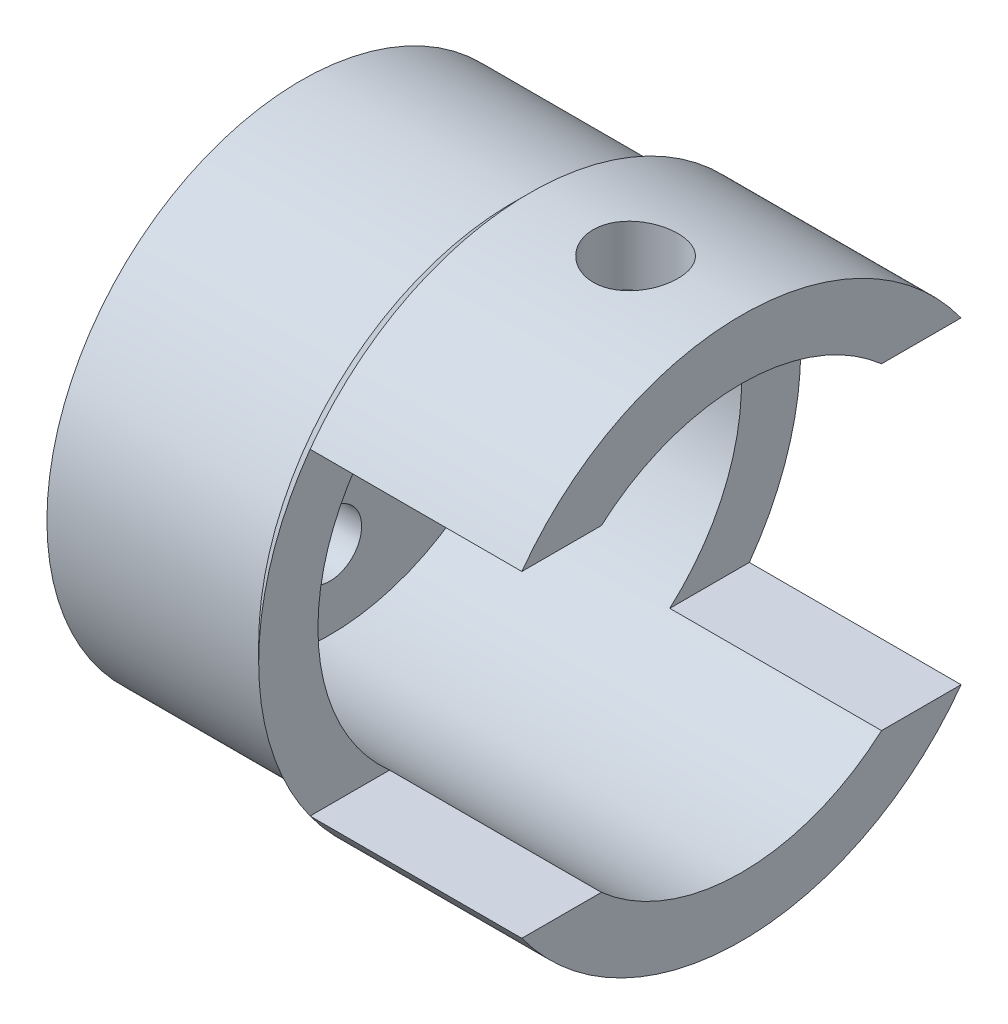
ISO-10303-21;
HEADER;
FILE_DESCRIPTION(('STEP AP214'),'2;1');
FILE_NAME('part.step','',(''),(''),'','','');
FILE_SCHEMA(('AUTOMOTIVE_DESIGN { 1 0 10303 214 1 1 1 1 }'));
ENDSEC;
DATA;
#1=APPLICATION_CONTEXT('core data for automotive mechanical design processes');
#2=APPLICATION_PROTOCOL_DEFINITION('international standard','automotive_design',2000,#1);
#3=PRODUCT_CONTEXT('',#1,'mechanical');
#4=PRODUCT('Part','Part','',(#3));
#5=PRODUCT_RELATED_PRODUCT_CATEGORY('part','',(#4));
#6=PRODUCT_DEFINITION_FORMATION('','',#4);
#7=PRODUCT_DEFINITION_CONTEXT('part definition',#1,'design');
#8=PRODUCT_DEFINITION('design','',#6,#7);
#9=PRODUCT_DEFINITION_SHAPE('','',#8);
#10=(LENGTH_UNIT() NAMED_UNIT(*) SI_UNIT(.MILLI.,.METRE.));
#11=(NAMED_UNIT(*) PLANE_ANGLE_UNIT() SI_UNIT($,.RADIAN.));
#12=(NAMED_UNIT(*) SI_UNIT($,.STERADIAN.) SOLID_ANGLE_UNIT());
#13=UNCERTAINTY_MEASURE_WITH_UNIT(LENGTH_MEASURE(1.E-05),#10,'distance_accuracy_value','');
#14=(GEOMETRIC_REPRESENTATION_CONTEXT(3) GLOBAL_UNCERTAINTY_ASSIGNED_CONTEXT((#13)) GLOBAL_UNIT_ASSIGNED_CONTEXT((#10,
#11,#12)) REPRESENTATION_CONTEXT('',''));
#15=CARTESIAN_POINT('',(0.,0.,0.));
#16=DIRECTION('',(0.,0.,1.));
#17=DIRECTION('',(1.,0.,0.));
#18=AXIS2_PLACEMENT_3D('',#15,#16,#17);
#19=CARTESIAN_POINT('',(20.7985083905838,12.7985083905838,0.));
#20=DIRECTION('',(-1.,0.,0.));
#21=DIRECTION('',(0.,0.,1.));
#22=AXIS2_PLACEMENT_3D('',#19,#20,#21);
#23=PLANE('',#22);
#24=CARTESIAN_POINT('',(20.7985083905838,0.,0.));
#25=DIRECTION('',(-1.,0.,0.));
#26=DIRECTION('',(0.,0.,1.));
#27=AXIS2_PLACEMENT_3D('',#24,#25,#26);
#28=CIRCLE('',#27,12.7985083905838);
#29=CARTESIAN_POINT('',(20.7985083905838,7.50149160941622,10.369640334057));
#30=VERTEX_POINT('',#29);
#31=CARTESIAN_POINT('',(20.7985083905838,7.50149160941622,-10.369640334057));
#32=VERTEX_POINT('',#31);
#33=EDGE_CURVE('E144',#30,#32,#28,.T.);
#34=ORIENTED_EDGE('',*,*,#33,.F.);
#35=DIRECTION('',(0.,0.,-1.));
#36=VECTOR('',#35,1.);
#37=CARTESIAN_POINT('',(20.7985083905838,7.50149160941622,12.7985083905838));
#38=LINE('',#37,#36);
#39=CARTESIAN_POINT('',(20.7985083905838,7.50149160941622,6.61268656703598));
#40=VERTEX_POINT('',#39);
#41=EDGE_CURVE('E160',#30,#40,#38,.T.);
#42=ORIENTED_EDGE('',*,*,#41,.T.);
#43=CARTESIAN_POINT('',(20.7985083905838,0.,0.));
#44=DIRECTION('',(-1.,0.,0.));
#45=DIRECTION('',(0.,0.,1.));
#46=AXIS2_PLACEMENT_3D('',#43,#44,#45);
#47=CIRCLE('',#46,10.);
#48=CARTESIAN_POINT('',(20.7985083905838,7.50149160941622,-6.61268656703598));
#49=VERTEX_POINT('',#48);
#50=EDGE_CURVE('E45',#40,#49,#47,.T.);
#51=ORIENTED_EDGE('',*,*,#50,.T.);
#52=EDGE_CURVE('E161',#49,#32,#38,.T.);
#53=ORIENTED_EDGE('',*,*,#52,.T.);
#54=EDGE_LOOP('',(#34,#42,#51,#53));
#55=FACE_BOUND('',#54,.T.);
#56=ADVANCED_FACE('F32',(#55),#23,.F.);
#57=CARTESIAN_POINT('',(0.,0.,0.));
#58=DIRECTION('',(-1.,0.,0.));
#59=DIRECTION('',(0.,0.,1.));
#60=AXIS2_PLACEMENT_3D('',#57,#58,#59);
#61=CYLINDRICAL_SURFACE('',#60,12.7985083905838);
#62=CARTESIAN_POINT('',(15.7985083905838,12.6412743433502,2.));
#63=CARTESIAN_POINT('',(15.6869058605762,12.641276267797,1.99999543357107));
#64=CARTESIAN_POINT('',(15.5752399420003,12.6427682559038,1.99062705088806));
#65=CARTESIAN_POINT('',(15.3550341977451,12.6485704548972,1.95341329939025));
#66=CARTESIAN_POINT('',(15.2464974642779,12.65288336,1.92555026623031));
#67=CARTESIAN_POINT('',(15.035769181485,12.6638272481015,1.8522046351433));
#68=CARTESIAN_POINT('',(14.9335726792747,12.6704563941417,1.80673599674197));
#69=CARTESIAN_POINT('',(14.7382726580606,12.6852836500622,1.69950342909167));
#70=CARTESIAN_POINT('',(14.6451679728494,12.6934815583171,1.63774159354278));
#71=CARTESIAN_POINT('',(14.4698732090248,12.7106021747007,1.49910361434302));
#72=CARTESIAN_POINT('',(14.387773486387,12.7195300161363,1.42211384315624));
#73=CARTESIAN_POINT('',(14.2376028270097,12.7370588199866,1.25545089563176));
#74=CARTESIAN_POINT('',(14.1695326831224,12.745659763905,1.16577700296029));
#75=CARTESIAN_POINT('',(14.0490179083089,12.761619621821,0.975709988234255));
#76=CARTESIAN_POINT('',(13.996656815719,12.7689718084111,0.875263284400821));
#77=CARTESIAN_POINT('',(13.9095828872721,12.7815488035089,0.666866593211987));
#78=CARTESIAN_POINT('',(13.8748690409104,12.7867737338227,0.558917035882352));
#79=CARTESIAN_POINT('',(13.8243498288832,12.7944712847631,0.339510639666842));
#80=CARTESIAN_POINT('',(13.8083929570219,12.7969659471815,0.228089471550327));
#81=CARTESIAN_POINT('',(13.7953699648494,12.7989974939656,0.0041251175521217));
#82=CARTESIAN_POINT('',(13.7983027091467,12.7985345561028,-0.108418000486929));
#83=CARTESIAN_POINT('',(13.8228566498631,12.7947206148355,-0.33039709372246));
#84=CARTESIAN_POINT('',(13.8443148302482,12.791394804249,-0.439851595198562));
#85=CARTESIAN_POINT('',(13.905054346536,12.7822568744753,-0.653586977627946));
#86=CARTESIAN_POINT('',(13.944336172537,12.7764446869204,-0.757867716230341));
#87=CARTESIAN_POINT('',(14.0397730167662,12.7629439003276,-0.958785697552394));
#88=CARTESIAN_POINT('',(14.0959961305402,12.7552477525786,-1.05539006672247));
#89=CARTESIAN_POINT('',(14.2236698046218,12.7388358094737,-1.23785467216926));
#90=CARTESIAN_POINT('',(14.295121451328,12.7301199413913,-1.32371414121434));
#91=CARTESIAN_POINT('',(14.4521306320659,12.7125298134921,-1.48321345968578));
#92=CARTESIAN_POINT('',(14.5378305506789,12.7036548559482,-1.55671314020442));
#93=CARTESIAN_POINT('',(14.7204212808508,12.686837254181,-1.68831051307547));
#94=CARTESIAN_POINT('',(14.817312172947,12.6788946166681,-1.74640809457469));
#95=CARTESIAN_POINT('',(15.0196865587552,12.6648409336946,-1.84557415390882));
#96=CARTESIAN_POINT('',(15.1251776737784,12.6587315357446,-1.88662732676936));
#97=CARTESIAN_POINT('',(15.3416746959378,12.6490644906922,-1.950393445058));
#98=CARTESIAN_POINT('',(15.4526801787227,12.6455066475624,-1.97310779941372));
#99=CARTESIAN_POINT('',(15.6758052342861,12.6413830051067,-1.99935739907929));
#100=CARTESIAN_POINT('',(15.7879008288749,12.6407861461156,-2.00309174808386));
#101=CARTESIAN_POINT('',(16.0111164244017,12.6425694918701,-1.99180447200951));
#102=CARTESIAN_POINT('',(16.1222364581654,12.6449495960575,-1.97678348046343));
#103=CARTESIAN_POINT('',(16.339724128783,12.6523900987213,-1.92858110818959));
#104=CARTESIAN_POINT('',(16.4461144731461,12.6574357366734,-1.89549970449695));
#105=CARTESIAN_POINT('',(16.6518405164068,12.6696265409608,-1.81221987696943));
#106=CARTESIAN_POINT('',(16.7511758394319,12.6767718190553,-1.76202054196291));
#107=CARTESIAN_POINT('',(16.9408622714874,12.6924296202181,-1.64545454173463));
#108=CARTESIAN_POINT('',(17.0311335712755,12.7009528105223,-1.57895946190561));
#109=CARTESIAN_POINT('',(17.1993073570685,12.7183743017194,-1.43186721215676));
#110=CARTESIAN_POINT('',(17.2772090813452,12.7272726256707,-1.35126917440749));
#111=CARTESIAN_POINT('',(17.4191517880307,12.7445392695237,-1.17738011445609));
#112=CARTESIAN_POINT('',(17.483060516133,12.7529020444379,-1.08398050257701));
#113=CARTESIAN_POINT('',(17.5942798717231,12.7680681664951,-0.887655263176701));
#114=CARTESIAN_POINT('',(17.6415909843325,12.7748715592143,-0.784729914188609));
#115=CARTESIAN_POINT('',(17.7180628032108,12.7861281353381,-0.572680474982769));
#116=CARTESIAN_POINT('',(17.7472946870717,12.7905905245543,-0.463582563135936));
#117=CARTESIAN_POINT('',(17.7870082110859,12.7967010488831,-0.241951300861597));
#118=CARTESIAN_POINT('',(17.7974912000507,12.7983493864406,-0.129418198157121));
#119=CARTESIAN_POINT('',(17.7993742913255,12.798643752792,0.0946086136872319));
#120=CARTESIAN_POINT('',(17.7909763360435,12.7973215532737,0.206100635873306));
#121=CARTESIAN_POINT('',(17.7557702138955,12.7918877612436,0.426066077647656));
#122=CARTESIAN_POINT('',(17.7289621211659,12.7877761799645,0.534539509389764));
#123=CARTESIAN_POINT('',(17.6577705162137,12.7772236117483,0.745325224144663));
#124=CARTESIAN_POINT('',(17.6134021559729,12.770784633434,0.847642731381726));
#125=CARTESIAN_POINT('',(17.5083713307282,12.7562829211048,1.04341257371094));
#126=CARTESIAN_POINT('',(17.4477082467586,12.7482201254111,1.13686457185836));
#127=CARTESIAN_POINT('',(17.3110849233018,12.7312637354005,1.31327243090961));
#128=CARTESIAN_POINT('',(17.234976007918,12.722362555283,1.39611242834961));
#129=CARTESIAN_POINT('',(17.0699341932363,12.7047874005652,1.54791767104431));
#130=CARTESIAN_POINT('',(16.9809982919691,12.6961134797148,1.61687965927815));
#131=CARTESIAN_POINT('',(16.7921825857016,12.6799176923513,1.73935488854612));
#132=CARTESIAN_POINT('',(16.6922389589204,12.6724032237801,1.79277070906887));
#133=CARTESIAN_POINT('',(16.4847255103249,12.659464111906,1.8819762677244));
#134=CARTESIAN_POINT('',(16.3771636253004,12.6540373304704,1.91778404988061));
#135=CARTESIAN_POINT('',(16.1907025704876,12.6471236100172,1.9627573441535));
#136=CARTESIAN_POINT('',(16.1129471438257,12.6449419691942,1.97670159728243));
#137=CARTESIAN_POINT('',(15.9563078288117,12.6420166660549,1.9953244714291));
#138=CARTESIAN_POINT('',(15.8774239571052,12.6412729825494,2.00000322897991));
#139=CARTESIAN_POINT('',(15.7985083905838,12.6412743433502,2.));
#140=B_SPLINE_CURVE_WITH_KNOTS('',3,(#62,#63,#64,#65,#66,#67,#68,#69,#70,#71,#72,#73,#74,#75,
#76,#77,#78,#79,#80,#81,#82,#83,#84,#85,#86,#87,#88,#89,#90,#91,#92,#93,#94,#95,#96,#97,#98,#99,
#100,#101,#102,#103,#104,#105,#106,#107,#108,#109,#110,#111,#112,#113,#114,#115,#116,#117,#118,
#119,#120,#121,#122,#123,#124,#125,#126,#127,#128,#129,#130,#131,#132,#133,#134,#135,#136,#137,
#138,#139),.UNSPECIFIED.,.T.,.F.,(4,2,2,2,2,2,2,2,2,2,2,2,2,2,2,2,2,2,2,2,2,2,2,2,2,2,2,2,2,2,2,
2,2,2,2,2,2,2,4),(0.,0.33451909675687,0.669358155211654,1.00393226087374,1.33846339418985,
1.6755918988916,2.0127394504802,2.35164935486035,2.69053985062487,3.02667378615881,
3.362787517995,3.69597339205187,4.02916842830526,4.36372102472492,4.6982974960112,
5.03644414968647,5.3745932370312,5.71304531100723,6.05147138004382,6.38633986203007,
6.72119703286797,7.05421905820461,7.38725881276313,7.72301252087598,8.05878689695698,
8.39760957799704,8.73642235496969,9.07389259664657,9.41133855944708,9.74519253575277,
10.0790451676587,10.4126103586597,10.746188222147,11.0831438249541,11.4201784156628,
11.7592816823955,12.0980367215121,12.334582909511,12.5711256118226),.UNSPECIFIED.);
#141=CARTESIAN_POINT('',(15.7985083905838,12.6412743433502,2.));
#142=VERTEX_POINT('',#141);
#143=EDGE_CURVE('E163',#142,#142,#140,.T.);
#144=ORIENTED_EDGE('',*,*,#143,.T.);
#145=EDGE_LOOP('',(#144));
#146=FACE_BOUND('',#145,.T.);
#147=ORIENTED_EDGE('',*,*,#33,.T.);
#148=DIRECTION('',(-1.,0.,0.));
#149=VECTOR('',#148,1.);
#150=CARTESIAN_POINT('',(0.,7.50149160941622,-10.369640334057));
#151=LINE('',#150,#149);
#152=CARTESIAN_POINT('',(10.7985083905838,7.50149160941622,-10.369640334057));
#153=VERTEX_POINT('',#152);
#154=EDGE_CURVE('E60',#32,#153,#151,.T.);
#155=ORIENTED_EDGE('',*,*,#154,.T.);
#156=CARTESIAN_POINT('',(10.7985083905838,0.,0.));
#157=DIRECTION('',(-1.,0.,0.));
#158=DIRECTION('',(0.,0.,1.));
#159=AXIS2_PLACEMENT_3D('',#156,#157,#158);
#160=CIRCLE('',#159,12.7985083905838);
#161=CARTESIAN_POINT('',(10.7985083905838,7.50149160941622,10.369640334057));
#162=VERTEX_POINT('',#161);
#163=EDGE_CURVE('E114',#162,#153,#160,.T.);
#164=ORIENTED_EDGE('',*,*,#163,.F.);
#165=DIRECTION('',(-1.,0.,0.));
#166=VECTOR('',#165,1.);
#167=CARTESIAN_POINT('',(0.,7.50149160941622,10.369640334057));
#168=LINE('',#167,#166);
#169=EDGE_CURVE('E159',#162,#30,#168,.F.);
#170=ORIENTED_EDGE('',*,*,#169,.T.);
#171=EDGE_LOOP('',(#147,#155,#164,#170));
#172=FACE_BOUND('',#171,.T.);
#173=ADVANCED_FACE('F158',(#146,#172),#61,.T.);
#174=CARTESIAN_POINT('',(1.3607953337197,0.,0.));
#175=DIRECTION('',(-1.,0.,0.));
#176=DIRECTION('',(0.,0.,1.));
#177=AXIS2_PLACEMENT_3D('',#174,#175,#176);
#178=PLANE('',#177);
#179=CARTESIAN_POINT('',(1.3607953337197,6.3,0.));
#180=DIRECTION('',(-1.,0.,0.));
#181=DIRECTION('',(0.,0.,1.));
#182=AXIS2_PLACEMENT_3D('',#179,#180,#181);
#183=CIRCLE('',#182,1.5);
#184=CARTESIAN_POINT('',(1.3607953337197,6.3,1.5));
#185=VERTEX_POINT('',#184);
#186=EDGE_CURVE('E200',#185,#185,#183,.F.);
#187=ORIENTED_EDGE('',*,*,#186,.F.);
#188=EDGE_LOOP('',(#187));
#189=FACE_BOUND('',#188,.T.);
#190=CARTESIAN_POINT('',(1.3607953337197,0.,6.3));
#191=DIRECTION('',(-1.,0.,0.));
#192=DIRECTION('',(0.,0.,1.));
#193=AXIS2_PLACEMENT_3D('',#190,#191,#192);
#194=CIRCLE('',#193,1.5);
#195=CARTESIAN_POINT('',(1.3607953337197,0.,7.8));
#196=VERTEX_POINT('',#195);
#197=EDGE_CURVE('E201',#196,#196,#194,.F.);
#198=ORIENTED_EDGE('',*,*,#197,.F.);
#199=EDGE_LOOP('',(#198));
#200=FACE_BOUND('',#199,.T.);
#201=CARTESIAN_POINT('',(1.3607953337197,-6.3,0.));
#202=DIRECTION('',(-1.,0.,0.));
#203=DIRECTION('',(0.,0.,1.));
#204=AXIS2_PLACEMENT_3D('',#201,#202,#203);
#205=CIRCLE('',#204,1.5);
#206=CARTESIAN_POINT('',(1.3607953337197,-6.3,1.5));
#207=VERTEX_POINT('',#206);
#208=EDGE_CURVE('E188',#207,#207,#205,.F.);
#209=ORIENTED_EDGE('',*,*,#208,.F.);
#210=EDGE_LOOP('',(#209));
#211=FACE_BOUND('',#210,.T.);
#212=CARTESIAN_POINT('',(1.3607953337197,0.,-6.3));
#213=DIRECTION('',(-1.,0.,0.));
#214=DIRECTION('',(0.,0.,1.));
#215=AXIS2_PLACEMENT_3D('',#212,#213,#214);
#216=CIRCLE('',#215,1.5);
#217=CARTESIAN_POINT('',(1.3607953337197,0.,-4.8));
#218=VERTEX_POINT('',#217);
#219=EDGE_CURVE('E189',#218,#218,#216,.F.);
#220=ORIENTED_EDGE('',*,*,#219,.F.);
#221=EDGE_LOOP('',(#220));
#222=FACE_BOUND('',#221,.T.);
#223=CARTESIAN_POINT('',(1.3607953337197,0.,0.));
#224=DIRECTION('',(-1.,0.,0.));
#225=DIRECTION('',(0.,0.,1.));
#226=AXIS2_PLACEMENT_3D('',#223,#224,#225);
#227=CIRCLE('',#226,10.);
#228=CARTESIAN_POINT('',(1.3607953337197,0.,10.));
#229=VERTEX_POINT('',#228);
#230=EDGE_CURVE('E11',#229,#229,#227,.T.);
#231=ORIENTED_EDGE('',*,*,#230,.F.);
#232=EDGE_LOOP('',(#231));
#233=FACE_BOUND('',#232,.T.);
#234=CARTESIAN_POINT('',(1.3607953337197,0.,0.));
#235=DIRECTION('',(-1.,0.,0.));
#236=DIRECTION('',(0.,0.,1.));
#237=AXIS2_PLACEMENT_3D('',#234,#235,#236);
#238=CIRCLE('',#237,2.5);
#239=CARTESIAN_POINT('',(1.3607953337197,0.,2.5));
#240=VERTEX_POINT('',#239);
#241=EDGE_CURVE('E211',#240,#240,#238,.F.);
#242=ORIENTED_EDGE('',*,*,#241,.F.);
#243=EDGE_LOOP('',(#242));
#244=FACE_BOUND('',#243,.T.);
#245=ADVANCED_FACE('F34',(#189,#200,#211,#222,#233,#244),#178,.F.);
#246=CARTESIAN_POINT('',(0.,0.,0.));
#247=DIRECTION('',(-1.,0.,0.));
#248=DIRECTION('',(0.,0.,1.));
#249=AXIS2_PLACEMENT_3D('',#246,#247,#248);
#250=CYLINDRICAL_SURFACE('',#249,10.);
#251=CARTESIAN_POINT('',(15.7985083905838,9.79795897113271,2.));
#252=CARTESIAN_POINT('',(15.9096371415661,9.79796118053292,1.99999589175055));
#253=CARTESIAN_POINT('',(16.0208176372505,9.79987016537404,1.99070634343629));
#254=CARTESIAN_POINT('',(16.24003340087,9.80728862609749,1.95382456716569));
#255=CARTESIAN_POINT('',(16.3480660798557,9.81280098289574,1.92621769414099));
#256=CARTESIAN_POINT('',(16.5577829972922,9.82677747443709,1.85359156523949));
#257=CARTESIAN_POINT('',(16.659473433649,9.8352386724215,1.80858962830524));
#258=CARTESIAN_POINT('',(16.8538580799777,9.85415598961317,1.70249821534101));
#259=CARTESIAN_POINT('',(16.9465527916596,9.86461199746922,1.64140963720231));
#260=CARTESIAN_POINT('',(17.1216303982915,9.88650599388505,1.50395815130688));
#261=CARTESIAN_POINT('',(17.2038675663517,9.89795475674493,1.42741131182664));
#262=CARTESIAN_POINT('',(17.3544234577417,9.92044944605197,1.26161357804262));
#263=CARTESIAN_POINT('',(17.4227412054182,9.93149534421663,1.17236179395597));
#264=CARTESIAN_POINT('',(17.5440844258407,9.95205592835124,0.982722711848513));
#265=CARTESIAN_POINT('',(17.5969714182171,9.96155642883101,0.882245135344423));
#266=CARTESIAN_POINT('',(17.6850582646801,9.97783473767263,0.673608300774544));
#267=CARTESIAN_POINT('',(17.7202597743858,9.98461280088238,0.565449762841107));
#268=CARTESIAN_POINT('',(17.771522777823,9.99460641376836,0.346033546556989));
#269=CARTESIAN_POINT('',(17.7878303457258,9.99786772576254,0.234835478429628));
#270=CARTESIAN_POINT('',(17.8016102942604,10.0006184236721,0.0112371368750722));
#271=CARTESIAN_POINT('',(17.7990844898754,10.0001081730552,-0.101163019663687));
#272=CARTESIAN_POINT('',(17.7754560301527,9.99540869737031,-0.322284001487179));
#273=CARTESIAN_POINT('',(17.7546184362481,9.99127196731676,-0.431034428596942));
#274=CARTESIAN_POINT('',(17.695378325666,9.97984354318817,-0.643463253160604));
#275=CARTESIAN_POINT('',(17.6569751062,9.97255172288078,-0.747141447494259));
#276=CARTESIAN_POINT('',(17.5634483102892,9.95554592039917,-0.947238926401777));
#277=CARTESIAN_POINT('',(17.508220888374,9.94581696350447,-1.0436083482678));
#278=CARTESIAN_POINT('',(17.3826902361106,9.92500938947571,-1.22581009171952));
#279=CARTESIAN_POINT('',(17.3123852710427,9.91393061710444,-1.31164119905001));
#280=CARTESIAN_POINT('',(17.1572411463668,9.89141928728919,-1.47190286210692));
#281=CARTESIAN_POINT('',(17.0721700171246,9.87998392915032,-1.54610863314727));
#282=CARTESIAN_POINT('',(16.8906755056823,9.85823143197521,-1.67923698635362));
#283=CARTESIAN_POINT('',(16.7942519088174,9.84791431409096,-1.73815927945551));
#284=CARTESIAN_POINT('',(16.5924667269402,9.82956094945847,-1.83912562960377));
#285=CARTESIAN_POINT('',(16.4870864553045,9.82152963127098,-1.88113329555542));
#286=CARTESIAN_POINT('',(16.2705657431358,9.80872952642545,-1.94678068325517));
#287=CARTESIAN_POINT('',(16.1594260553456,9.80396031456855,-1.97042279891329));
#288=CARTESIAN_POINT('',(15.9365786745857,9.79830958535655,-1.99833201207211));
#289=CARTESIAN_POINT('',(15.8249132419631,9.79736294114308,-2.00292371779583));
#290=CARTESIAN_POINT('',(15.6024119441844,9.79928971377707,-1.99347525662148));
#291=CARTESIAN_POINT('',(15.4915760323461,9.80216291400776,-1.97943614624489));
#292=CARTESIAN_POINT('',(15.2749711099993,9.81134464989829,-1.93340441614832));
#293=CARTESIAN_POINT('',(15.1691637045123,9.81761998028993,-1.9015852416786));
#294=CARTESIAN_POINT('',(14.9643818325263,9.83286978703329,-1.82108207061704));
#295=CARTESIAN_POINT('',(14.8654079297123,9.84184448572539,-1.77239668474636));
#296=CARTESIAN_POINT('',(14.6756821706835,9.86162811924079,-1.6588082844312));
#297=CARTESIAN_POINT('',(14.5850542979821,9.87245943729806,-1.59370215596551));
#298=CARTESIAN_POINT('',(14.4158917665819,9.89467447653273,-1.44939114442543));
#299=CARTESIAN_POINT('',(14.3373583540853,9.90605825447636,-1.37018481028908));
#300=CARTESIAN_POINT('',(14.1933832722126,9.92830691738431,-1.19846454699578));
#301=CARTESIAN_POINT('',(14.1281610812838,9.93916115417367,-1.10576499785926));
#302=CARTESIAN_POINT('',(14.0142166275846,9.9589425525724,-0.910535793269511));
#303=CARTESIAN_POINT('',(13.9654936718942,9.96786979510422,-0.808006550867013));
#304=CARTESIAN_POINT('',(13.8862506470905,9.98274588122132,-0.596605361648025));
#305=CARTESIAN_POINT('',(13.8556273541313,9.98871158285205,-0.487773346956156));
#306=CARTESIAN_POINT('',(13.8131258952561,9.99706471875323,-0.266378909359823));
#307=CARTESIAN_POINT('',(13.8012454716324,9.99945258399698,-0.153816937422423));
#308=CARTESIAN_POINT('',(13.796654428658,10.0003708090823,0.0697457878072434));
#309=CARTESIAN_POINT('',(13.8036138296713,9.99896757098659,0.180739624282989));
#310=CARTESIAN_POINT('',(13.8357762916794,9.99260087120678,0.399942062631301));
#311=CARTESIAN_POINT('',(13.86097912328,9.98763745428862,0.508150699507447));
#312=CARTESIAN_POINT('',(13.928766374767,9.97470996729841,0.718505499490132));
#313=CARTESIAN_POINT('',(13.9713111468457,9.9667527449523,0.820664886480331));
#314=CARTESIAN_POINT('',(14.072532873246,9.9486944424736,1.01644244037214));
#315=CARTESIAN_POINT('',(14.1312111023928,9.93859319293976,1.11005993153569));
#316=CARTESIAN_POINT('',(14.2641471647063,9.9171519831348,1.28772778021183));
#317=CARTESIAN_POINT('',(14.3386410633513,9.90579466835801,1.37159943222969));
#318=CARTESIAN_POINT('',(14.5006088707813,9.8832244581573,1.52576523551702));
#319=CARTESIAN_POINT('',(14.5880858495436,9.87201159757438,1.59605616641783));
#320=CARTESIAN_POINT('',(14.7746670239646,9.85086685467863,1.72178443889997));
#321=CARTESIAN_POINT('',(14.8738863128263,9.84095007142451,1.77705362923618));
#322=CARTESIAN_POINT('',(15.080373937104,9.82370474252826,1.87004809853246));
#323=CARTESIAN_POINT('',(15.1876348679582,9.81637385049967,1.90778929194833));
#324=CARTESIAN_POINT('',(15.3790333014695,9.8065936227569,1.95733827971531));
#325=CARTESIAN_POINT('',(15.4620792296117,9.80337569829212,1.97330779704737));
#326=CARTESIAN_POINT('',(15.6295762996861,9.79905756918168,1.99464003591942));
#327=CARTESIAN_POINT('',(15.7140273930727,9.79795729152836,2.00000312312529));
#328=CARTESIAN_POINT('',(15.7985083905838,9.79795897113271,2.));
#329=B_SPLINE_CURVE_WITH_KNOTS('',3,(#251,#252,#253,#254,#255,#256,#257,#258,#259,#260,#261,
#262,#263,#264,#265,#266,#267,#268,#269,#270,#271,#272,#273,#274,#275,#276,#277,#278,#279,#280,
#281,#282,#283,#284,#285,#286,#287,#288,#289,#290,#291,#292,#293,#294,#295,#296,#297,#298,#299,
#300,#301,#302,#303,#304,#305,#306,#307,#308,#309,#310,#311,#312,#313,#314,#315,#316,#317,#318,
#319,#320,#321,#322,#323,#324,#325,#326,#327,#328),.UNSPECIFIED.,.T.,.F.,(4,2,2,2,2,2,2,2,2,2,2,
2,2,2,2,2,2,2,2,2,2,2,2,2,2,2,2,2,2,2,2,2,2,2,2,2,2,2,4),(0.,0.333076927738854,
0.666420478568594,0.999432995881169,1.33242692971973,1.66964505096874,2.00688680070844,
2.34706800874901,2.6872173649312,3.02288497766161,3.35852024232497,3.68937579267076,
4.02024458147501,4.35319848444607,4.68619071540133,5.02498693524968,5.36378956245442,
5.70331726345554,6.0428007003205,6.37647515609188,6.71013069056844,7.04058683566639,
7.37107020708798,7.70586119549044,8.04068665740419,8.38065203466903,8.72060313260211,
9.05859627157302,9.39654869383258,9.72862034829374,10.0606878273352,10.3920003415091,
10.7233390426937,11.060023040512,11.3967867777956,11.7371779715922,12.077259501804,
12.3304760727632,12.5836839137096),.UNSPECIFIED.);
#330=CARTESIAN_POINT('',(15.7985083905838,9.79795897113271,2.));
#331=VERTEX_POINT('',#330);
#332=EDGE_CURVE('E36',#331,#331,#329,.T.);
#333=ORIENTED_EDGE('',*,*,#332,.T.);
#334=EDGE_LOOP('',(#333));
#335=FACE_BOUND('',#334,.T.);
#336=ORIENTED_EDGE('',*,*,#50,.F.);
#337=DIRECTION('',(-1.,0.,0.));
#338=VECTOR('',#337,1.);
#339=CARTESIAN_POINT('',(0.,7.50149160941622,6.61268656703598));
#340=LINE('',#339,#338);
#341=CARTESIAN_POINT('',(10.7985083905838,7.50149160941622,6.61268656703598));
#342=VERTEX_POINT('',#341);
#343=EDGE_CURVE('E179',#40,#342,#340,.T.);
#344=ORIENTED_EDGE('',*,*,#343,.T.);
#345=CARTESIAN_POINT('',(10.7985083905838,0.,0.));
#346=DIRECTION('',(-1.,0.,0.));
#347=DIRECTION('',(0.,0.,1.));
#348=AXIS2_PLACEMENT_3D('',#345,#346,#347);
#349=CIRCLE('',#348,10.);
#350=CARTESIAN_POINT('',(10.7985083905838,-7.49850839058378,6.61606921943419));
#351=VERTEX_POINT('',#350);
#352=EDGE_CURVE('E174',#342,#351,#349,.F.);
#353=ORIENTED_EDGE('',*,*,#352,.T.);
#354=DIRECTION('',(-1.,0.,0.));
#355=VECTOR('',#354,1.);
#356=CARTESIAN_POINT('',(0.,-7.49850839058378,6.61606921943419));
#357=LINE('',#356,#355);
#358=CARTESIAN_POINT('',(20.7985083905838,-7.49850839058378,6.61606921943419));
#359=VERTEX_POINT('',#358);
#360=EDGE_CURVE('E123',#351,#359,#357,.F.);
#361=ORIENTED_EDGE('',*,*,#360,.T.);
#362=CARTESIAN_POINT('',(20.7985083905838,-7.49850839058378,-6.61606921943419));
#363=VERTEX_POINT('',#362);
#364=EDGE_CURVE('E146',#363,#359,#47,.T.);
#365=ORIENTED_EDGE('',*,*,#364,.F.);
#366=DIRECTION('',(-1.,0.,0.));
#367=VECTOR('',#366,1.);
#368=CARTESIAN_POINT('',(0.,-7.49850839058378,-6.61606921943419));
#369=LINE('',#368,#367);
#370=CARTESIAN_POINT('',(10.7985083905838,-7.49850839058378,-6.61606921943419));
#371=VERTEX_POINT('',#370);
#372=EDGE_CURVE('E133',#363,#371,#369,.T.);
#373=ORIENTED_EDGE('',*,*,#372,.T.);
#374=CARTESIAN_POINT('',(10.7985083905838,7.50149160941622,-6.61268656703598));
#375=VERTEX_POINT('',#374);
#376=EDGE_CURVE('E176',#371,#375,#349,.F.);
#377=ORIENTED_EDGE('',*,*,#376,.T.);
#378=DIRECTION('',(-1.,0.,0.));
#379=VECTOR('',#378,1.);
#380=CARTESIAN_POINT('',(0.,7.50149160941622,-6.61268656703598));
#381=LINE('',#380,#379);
#382=EDGE_CURVE('E182',#375,#49,#381,.F.);
#383=ORIENTED_EDGE('',*,*,#382,.T.);
#384=EDGE_LOOP('',(#336,#344,#353,#361,#365,#373,#377,#383));
#385=FACE_BOUND('',#384,.T.);
#386=ORIENTED_EDGE('',*,*,#230,.T.);
#387=EDGE_LOOP('',(#386));
#388=FACE_BOUND('',#387,.T.);
#389=ADVANCED_FACE('F238',(#335,#385,#388),#250,.F.);
#390=CARTESIAN_POINT('',(20.7985083905838,-7.49850839058378,-10.3717977679951));
#391=VERTEX_POINT('',#390);
#392=CARTESIAN_POINT('',(20.7985083905838,-7.49850839058378,10.3717977679951));
#393=VERTEX_POINT('',#392);
#394=EDGE_CURVE('E113',#391,#393,#28,.T.);
#395=ORIENTED_EDGE('',*,*,#394,.F.);
#396=DIRECTION('',(0.,0.,-1.));
#397=VECTOR('',#396,1.);
#398=CARTESIAN_POINT('',(20.7985083905838,-7.49850839058378,12.7985083905838));
#399=LINE('',#398,#397);
#400=EDGE_CURVE('E165',#363,#391,#399,.T.);
#401=ORIENTED_EDGE('',*,*,#400,.F.);
#402=ORIENTED_EDGE('',*,*,#364,.T.);
#403=EDGE_CURVE('E243',#393,#359,#399,.T.);
#404=ORIENTED_EDGE('',*,*,#403,.F.);
#405=EDGE_LOOP('',(#395,#401,#402,#404));
#406=FACE_BOUND('',#405,.T.);
#407=ADVANCED_FACE('F229',(#406),#23,.F.);
#408=ORIENTED_EDGE('',*,*,#394,.T.);
#409=DIRECTION('',(-1.,0.,0.));
#410=VECTOR('',#409,1.);
#411=CARTESIAN_POINT('',(0.,-7.49850839058378,10.3717977679951));
#412=LINE('',#411,#410);
#413=CARTESIAN_POINT('',(10.7985083905838,-7.49850839058378,10.3717977679951));
#414=VERTEX_POINT('',#413);
#415=EDGE_CURVE('E120',#393,#414,#412,.T.);
#416=ORIENTED_EDGE('',*,*,#415,.T.);
#417=CARTESIAN_POINT('',(10.7985083905838,-7.49850839058378,-10.3717977679951));
#418=VERTEX_POINT('',#417);
#419=EDGE_CURVE('E116',#418,#414,#160,.T.);
#420=ORIENTED_EDGE('',*,*,#419,.F.);
#421=DIRECTION('',(-1.,0.,0.));
#422=VECTOR('',#421,1.);
#423=CARTESIAN_POINT('',(0.,-7.49850839058378,-10.3717977679951));
#424=LINE('',#423,#422);
#425=EDGE_CURVE('E134',#418,#391,#424,.F.);
#426=ORIENTED_EDGE('',*,*,#425,.T.);
#427=EDGE_LOOP('',(#408,#416,#420,#426));
#428=FACE_BOUND('',#427,.T.);
#429=ADVANCED_FACE('F130',(#428),#61,.T.);
#430=CARTESIAN_POINT('',(10.7985083905838,0.,0.));
#431=DIRECTION('',(1.,0.,0.));
#432=DIRECTION('',(0.,0.,-1.));
#433=AXIS2_PLACEMENT_3D('',#430,#431,#432);
#434=CONICAL_SURFACE('',#433,12.7985083905838,0.785398163397448);
#435=CARTESIAN_POINT('',(10.,0.,0.));
#436=DIRECTION('',(-1.,0.,0.));
#437=DIRECTION('',(0.,0.,1.));
#438=AXIS2_PLACEMENT_3D('',#435,#436,#437);
#439=CIRCLE('',#438,12.);
#440=CARTESIAN_POINT('',(10.,0.,12.));
#441=VERTEX_POINT('',#440);
#442=EDGE_CURVE('E137',#441,#441,#439,.T.);
#443=ORIENTED_EDGE('',*,*,#442,.F.);
#444=EDGE_LOOP('',(#443));
#445=FACE_BOUND('',#444,.T.);
#446=EDGE_CURVE('E105',#414,#162,#160,.T.);
#447=ORIENTED_EDGE('',*,*,#446,.T.);
#448=ORIENTED_EDGE('',*,*,#163,.T.);
#449=EDGE_CURVE('E52',#153,#418,#160,.T.);
#450=ORIENTED_EDGE('',*,*,#449,.T.);
#451=ORIENTED_EDGE('',*,*,#419,.T.);
#452=EDGE_LOOP('',(#447,#448,#450,#451));
#453=FACE_BOUND('',#452,.T.);
#454=ADVANCED_FACE('F136',(#445,#453),#434,.T.);
#455=CARTESIAN_POINT('',(0.,0.,0.));
#456=DIRECTION('',(-1.,0.,0.));
#457=DIRECTION('',(0.,0.,1.));
#458=AXIS2_PLACEMENT_3D('',#455,#456,#457);
#459=CYLINDRICAL_SURFACE('',#458,12.);
#460=CARTESIAN_POINT('',(0.,0.,0.));
#461=DIRECTION('',(-1.,0.,0.));
#462=DIRECTION('',(0.,0.,1.));
#463=AXIS2_PLACEMENT_3D('',#460,#461,#462);
#464=CIRCLE('',#463,12.);
#465=CARTESIAN_POINT('',(0.,0.,12.));
#466=VERTEX_POINT('',#465);
#467=EDGE_CURVE('E139',#466,#466,#464,.T.);
#468=ORIENTED_EDGE('',*,*,#467,.F.);
#469=EDGE_LOOP('',(#468));
#470=FACE_BOUND('',#469,.T.);
#471=ORIENTED_EDGE('',*,*,#442,.T.);
#472=EDGE_LOOP('',(#471));
#473=FACE_BOUND('',#472,.T.);
#474=ADVANCED_FACE('F218',(#470,#473),#459,.T.);
#475=CARTESIAN_POINT('',(0.,10.,0.));
#476=DIRECTION('',(1.,0.,0.));
#477=DIRECTION('',(0.,0.,-1.));
#478=AXIS2_PLACEMENT_3D('',#475,#476,#477);
#479=PLANE('',#478);
#480=CARTESIAN_POINT('',(0.,6.3,0.));
#481=DIRECTION('',(-1.,0.,0.));
#482=DIRECTION('',(0.,0.,1.));
#483=AXIS2_PLACEMENT_3D('',#480,#481,#482);
#484=CIRCLE('',#483,1.5);
#485=CARTESIAN_POINT('',(0.,6.3,1.5));
#486=VERTEX_POINT('',#485);
#487=EDGE_CURVE('E197',#486,#486,#484,.T.);
#488=ORIENTED_EDGE('',*,*,#487,.F.);
#489=EDGE_LOOP('',(#488));
#490=FACE_BOUND('',#489,.T.);
#491=CARTESIAN_POINT('',(0.,0.,6.3));
#492=DIRECTION('',(-1.,0.,0.));
#493=DIRECTION('',(0.,0.,1.));
#494=AXIS2_PLACEMENT_3D('',#491,#492,#493);
#495=CIRCLE('',#494,1.5);
#496=CARTESIAN_POINT('',(0.,0.,7.8));
#497=VERTEX_POINT('',#496);
#498=EDGE_CURVE('E192',#497,#497,#495,.T.);
#499=ORIENTED_EDGE('',*,*,#498,.F.);
#500=EDGE_LOOP('',(#499));
#501=FACE_BOUND('',#500,.T.);
#502=CARTESIAN_POINT('',(0.,-6.3,0.));
#503=DIRECTION('',(-1.,0.,0.));
#504=DIRECTION('',(0.,0.,1.));
#505=AXIS2_PLACEMENT_3D('',#502,#503,#504);
#506=CIRCLE('',#505,1.5);
#507=CARTESIAN_POINT('',(0.,-6.3,1.5));
#508=VERTEX_POINT('',#507);
#509=EDGE_CURVE('E185',#508,#508,#506,.T.);
#510=ORIENTED_EDGE('',*,*,#509,.F.);
#511=EDGE_LOOP('',(#510));
#512=FACE_BOUND('',#511,.T.);
#513=CARTESIAN_POINT('',(0.,0.,-6.3));
#514=DIRECTION('',(-1.,0.,0.));
#515=DIRECTION('',(0.,0.,1.));
#516=AXIS2_PLACEMENT_3D('',#513,#514,#515);
#517=CIRCLE('',#516,1.5);
#518=CARTESIAN_POINT('',(0.,0.,-4.8));
#519=VERTEX_POINT('',#518);
#520=EDGE_CURVE('E184',#519,#519,#517,.T.);
#521=ORIENTED_EDGE('',*,*,#520,.F.);
#522=EDGE_LOOP('',(#521));
#523=FACE_BOUND('',#522,.T.);
#524=CARTESIAN_POINT('',(0.,0.,0.));
#525=DIRECTION('',(-1.,0.,0.));
#526=DIRECTION('',(0.,0.,1.));
#527=AXIS2_PLACEMENT_3D('',#524,#525,#526);
#528=CIRCLE('',#527,2.5);
#529=CARTESIAN_POINT('',(0.,0.,2.5));
#530=VERTEX_POINT('',#529);
#531=EDGE_CURVE('E204',#530,#530,#528,.T.);
#532=ORIENTED_EDGE('',*,*,#531,.F.);
#533=EDGE_LOOP('',(#532));
#534=FACE_BOUND('',#533,.T.);
#535=ORIENTED_EDGE('',*,*,#467,.T.);
#536=EDGE_LOOP('',(#535));
#537=FACE_BOUND('',#536,.T.);
#538=ADVANCED_FACE('F216',(#490,#501,#512,#523,#534,#537),#479,.F.);
#539=CARTESIAN_POINT('',(20.7995083905838,0.,0.));
#540=DIRECTION('',(-1.,0.,0.));
#541=DIRECTION('',(0.,0.,1.));
#542=AXIS2_PLACEMENT_3D('',#539,#540,#541);
#543=CYLINDRICAL_SURFACE('',#542,2.5);
#544=ORIENTED_EDGE('',*,*,#531,.T.);
#545=EDGE_LOOP('',(#544));
#546=FACE_BOUND('',#545,.T.);
#547=ORIENTED_EDGE('',*,*,#241,.T.);
#548=EDGE_LOOP('',(#547));
#549=FACE_BOUND('',#548,.T.);
#550=ADVANCED_FACE('F281',(#546,#549),#543,.F.);
#551=CARTESIAN_POINT('',(20.7995083905838,0.,-6.3));
#552=DIRECTION('',(-1.,0.,0.));
#553=DIRECTION('',(0.,0.,1.));
#554=AXIS2_PLACEMENT_3D('',#551,#552,#553);
#555=CYLINDRICAL_SURFACE('',#554,1.5);
#556=ORIENTED_EDGE('',*,*,#520,.T.);
#557=EDGE_LOOP('',(#556));
#558=FACE_BOUND('',#557,.T.);
#559=ORIENTED_EDGE('',*,*,#219,.T.);
#560=EDGE_LOOP('',(#559));
#561=FACE_BOUND('',#560,.T.);
#562=ADVANCED_FACE('F277',(#558,#561),#555,.F.);
#563=CARTESIAN_POINT('',(20.7995083905838,-6.3,0.));
#564=DIRECTION('',(-1.,0.,0.));
#565=DIRECTION('',(0.,0.,1.));
#566=AXIS2_PLACEMENT_3D('',#563,#564,#565);
#567=CYLINDRICAL_SURFACE('',#566,1.5);
#568=ORIENTED_EDGE('',*,*,#509,.T.);
#569=EDGE_LOOP('',(#568));
#570=FACE_BOUND('',#569,.T.);
#571=ORIENTED_EDGE('',*,*,#208,.T.);
#572=EDGE_LOOP('',(#571));
#573=FACE_BOUND('',#572,.T.);
#574=ADVANCED_FACE('F273',(#570,#573),#567,.F.);
#575=CARTESIAN_POINT('',(20.7995083905838,0.,6.3));
#576=DIRECTION('',(-1.,0.,0.));
#577=DIRECTION('',(0.,0.,1.));
#578=AXIS2_PLACEMENT_3D('',#575,#576,#577);
#579=CYLINDRICAL_SURFACE('',#578,1.5);
#580=ORIENTED_EDGE('',*,*,#498,.T.);
#581=EDGE_LOOP('',(#580));
#582=FACE_BOUND('',#581,.T.);
#583=ORIENTED_EDGE('',*,*,#197,.T.);
#584=EDGE_LOOP('',(#583));
#585=FACE_BOUND('',#584,.T.);
#586=ADVANCED_FACE('F276',(#582,#585),#579,.F.);
#587=CARTESIAN_POINT('',(20.7995083905838,6.3,0.));
#588=DIRECTION('',(-1.,0.,0.));
#589=DIRECTION('',(0.,0.,1.));
#590=AXIS2_PLACEMENT_3D('',#587,#588,#589);
#591=CYLINDRICAL_SURFACE('',#590,1.5);
#592=ORIENTED_EDGE('',*,*,#487,.T.);
#593=EDGE_LOOP('',(#592));
#594=FACE_BOUND('',#593,.T.);
#595=ORIENTED_EDGE('',*,*,#186,.T.);
#596=EDGE_LOOP('',(#595));
#597=FACE_BOUND('',#596,.T.);
#598=ADVANCED_FACE('F283',(#594,#597),#591,.F.);
#599=CARTESIAN_POINT('',(10.7985083905838,7.50149160941622,12.7985083905838));
#600=DIRECTION('',(-1.,0.,0.));
#601=DIRECTION('',(0.,0.,1.));
#602=AXIS2_PLACEMENT_3D('',#599,#600,#601);
#603=PLANE('',#602);
#604=DIRECTION('',(0.,0.,-1.));
#605=VECTOR('',#604,1.);
#606=CARTESIAN_POINT('',(10.7985083905838,7.50149160941622,12.7985083905838));
#607=LINE('',#606,#605);
#608=EDGE_CURVE('E111',#162,#342,#607,.T.);
#609=ORIENTED_EDGE('',*,*,#608,.F.);
#610=ORIENTED_EDGE('',*,*,#446,.F.);
#611=DIRECTION('',(0.,0.,-1.));
#612=VECTOR('',#611,1.);
#613=CARTESIAN_POINT('',(10.7985083905838,-7.49850839058378,12.7985083905838));
#614=LINE('',#613,#612);
#615=EDGE_CURVE('E108',#414,#351,#614,.T.);
#616=ORIENTED_EDGE('',*,*,#615,.T.);
#617=ORIENTED_EDGE('',*,*,#352,.F.);
#618=EDGE_LOOP('',(#609,#610,#616,#617));
#619=FACE_BOUND('',#618,.T.);
#620=ADVANCED_FACE('F107',(#619),#603,.F.);
#621=CARTESIAN_POINT('',(20.7985083905838,-7.49850839058378,12.7985083905838));
#622=DIRECTION('',(0.,-1.,0.));
#623=DIRECTION('',(0.,0.,-1.));
#624=AXIS2_PLACEMENT_3D('',#621,#622,#623);
#625=PLANE('',#624);
#626=ORIENTED_EDGE('',*,*,#615,.F.);
#627=ORIENTED_EDGE('',*,*,#415,.F.);
#628=ORIENTED_EDGE('',*,*,#403,.T.);
#629=ORIENTED_EDGE('',*,*,#360,.F.);
#630=EDGE_LOOP('',(#626,#627,#628,#629));
#631=FACE_BOUND('',#630,.T.);
#632=ADVANCED_FACE('F119',(#631),#625,.F.);
#633=CARTESIAN_POINT('',(20.7985083905838,7.50149160941622,12.7985083905838));
#634=DIRECTION('',(0.,1.,0.));
#635=DIRECTION('',(0.,0.,1.));
#636=AXIS2_PLACEMENT_3D('',#633,#634,#635);
#637=PLANE('',#636);
#638=ORIENTED_EDGE('',*,*,#41,.F.);
#639=ORIENTED_EDGE('',*,*,#169,.F.);
#640=ORIENTED_EDGE('',*,*,#608,.T.);
#641=ORIENTED_EDGE('',*,*,#343,.F.);
#642=EDGE_LOOP('',(#638,#639,#640,#641));
#643=FACE_BOUND('',#642,.T.);
#644=ADVANCED_FACE('F252',(#643),#637,.F.);
#645=EDGE_CURVE('E124',#375,#153,#607,.T.);
#646=ORIENTED_EDGE('',*,*,#645,.T.);
#647=ORIENTED_EDGE('',*,*,#154,.F.);
#648=ORIENTED_EDGE('',*,*,#52,.F.);
#649=ORIENTED_EDGE('',*,*,#382,.F.);
#650=EDGE_LOOP('',(#646,#647,#648,#649));
#651=FACE_BOUND('',#650,.T.);
#652=ADVANCED_FACE('F267',(#651),#637,.F.);
#653=EDGE_CURVE('E125',#371,#418,#614,.T.);
#654=ORIENTED_EDGE('',*,*,#653,.T.);
#655=ORIENTED_EDGE('',*,*,#449,.F.);
#656=ORIENTED_EDGE('',*,*,#645,.F.);
#657=ORIENTED_EDGE('',*,*,#376,.F.);
#658=EDGE_LOOP('',(#654,#655,#656,#657));
#659=FACE_BOUND('',#658,.T.);
#660=ADVANCED_FACE('F263',(#659),#603,.F.);
#661=ORIENTED_EDGE('',*,*,#400,.T.);
#662=ORIENTED_EDGE('',*,*,#425,.F.);
#663=ORIENTED_EDGE('',*,*,#653,.F.);
#664=ORIENTED_EDGE('',*,*,#372,.F.);
#665=EDGE_LOOP('',(#661,#662,#663,#664));
#666=FACE_BOUND('',#665,.T.);
#667=ADVANCED_FACE('F246',(#666),#625,.F.);
#668=CARTESIAN_POINT('',(15.7985083905838,2.79850839058378,0.));
#669=DIRECTION('',(0.,1.,0.));
#670=DIRECTION('',(0.,0.,1.));
#671=AXIS2_PLACEMENT_3D('',#668,#669,#670);
#672=CYLINDRICAL_SURFACE('',#671,2.);
#673=ORIENTED_EDGE('',*,*,#332,.F.);
#674=EDGE_LOOP('',(#673));
#675=FACE_BOUND('',#674,.T.);
#676=ORIENTED_EDGE('',*,*,#143,.F.);
#677=EDGE_LOOP('',(#676));
#678=FACE_BOUND('',#677,.T.);
#679=ADVANCED_FACE('F258',(#675,#678),#672,.F.);
#680=CLOSED_SHELL('',(#56,#173,#245,#389,#407,#429,#454,#474,#538,#550,#562,#574,#586,#598,#620,
#632,#644,#652,#660,#667,#679));
#681=MANIFOLD_SOLID_BREP('B2',#680);
#682=ADVANCED_BREP_SHAPE_REPRESENTATION('',(#18,#681),#14);
#683=SHAPE_DEFINITION_REPRESENTATION(#9,#682);
ENDSEC;
END-ISO-10303-21;
